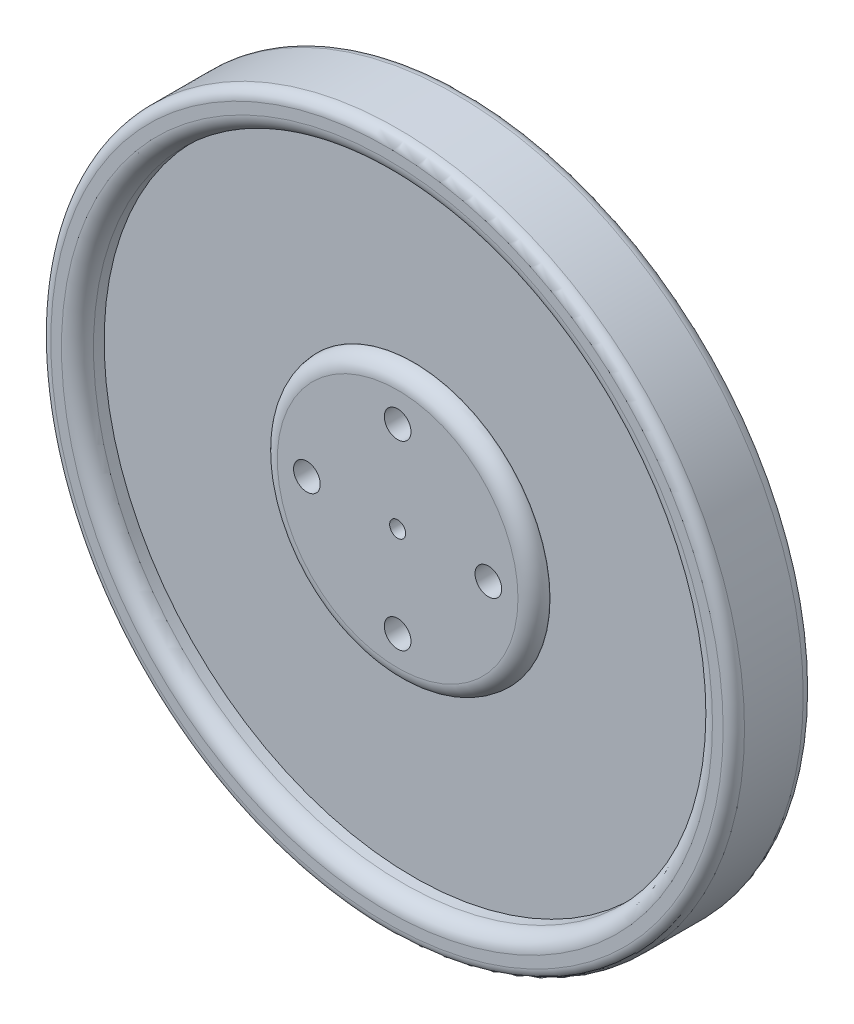
ISO-10303-21;
HEADER;
FILE_DESCRIPTION(('STEP AP214'),'2;1');
FILE_NAME('part.step','',(''),(''),'','','');
FILE_SCHEMA(('AUTOMOTIVE_DESIGN { 1 0 10303 214 1 1 1 1 }'));
ENDSEC;
DATA;
#1=APPLICATION_CONTEXT('core data for automotive mechanical design processes');
#2=APPLICATION_PROTOCOL_DEFINITION('international standard','automotive_design',2000,#1);
#3=PRODUCT_CONTEXT('',#1,'mechanical');
#4=PRODUCT('Part','Part','',(#3));
#5=PRODUCT_RELATED_PRODUCT_CATEGORY('part','',(#4));
#6=PRODUCT_DEFINITION_FORMATION('','',#4);
#7=PRODUCT_DEFINITION_CONTEXT('part definition',#1,'design');
#8=PRODUCT_DEFINITION('design','',#6,#7);
#9=PRODUCT_DEFINITION_SHAPE('','',#8);
#10=(LENGTH_UNIT() NAMED_UNIT(*) SI_UNIT(.MILLI.,.METRE.));
#11=(NAMED_UNIT(*) PLANE_ANGLE_UNIT() SI_UNIT($,.RADIAN.));
#12=(NAMED_UNIT(*) SI_UNIT($,.STERADIAN.) SOLID_ANGLE_UNIT());
#13=UNCERTAINTY_MEASURE_WITH_UNIT(LENGTH_MEASURE(1.E-05),#10,'distance_accuracy_value','');
#14=(GEOMETRIC_REPRESENTATION_CONTEXT(3) GLOBAL_UNCERTAINTY_ASSIGNED_CONTEXT((#13)) GLOBAL_UNIT_ASSIGNED_CONTEXT((#10,
#11,#12)) REPRESENTATION_CONTEXT('',''));
#15=CARTESIAN_POINT('',(0.,0.,0.));
#16=DIRECTION('',(0.,0.,1.));
#17=DIRECTION('',(1.,0.,0.));
#18=AXIS2_PLACEMENT_3D('',#15,#16,#17);
#19=CARTESIAN_POINT('',(0.,-8.5,10.));
#20=DIRECTION('',(0.,0.,-1.));
#21=DIRECTION('',(-1.,0.,0.));
#22=AXIS2_PLACEMENT_3D('',#19,#20,#21);
#23=CYLINDRICAL_SURFACE('',#22,1.25);
#24=CARTESIAN_POINT('',(0.,-8.5,3.));
#25=DIRECTION('',(0.,0.,-1.));
#26=DIRECTION('',(-1.,0.,0.));
#27=AXIS2_PLACEMENT_3D('',#24,#25,#26);
#28=CIRCLE('',#27,1.25);
#29=CARTESIAN_POINT('',(-1.25,-8.5,3.));
#30=VERTEX_POINT('',#29);
#31=EDGE_CURVE('E173',#30,#30,#28,.F.);
#32=ORIENTED_EDGE('',*,*,#31,.F.);
#33=EDGE_LOOP('',(#32));
#34=FACE_BOUND('',#33,.T.);
#35=CARTESIAN_POINT('',(0.,-8.5,6.5));
#36=DIRECTION('',(0.,0.,-1.));
#37=DIRECTION('',(-1.,0.,0.));
#38=AXIS2_PLACEMENT_3D('',#35,#36,#37);
#39=CIRCLE('',#38,1.25);
#40=CARTESIAN_POINT('',(-1.25,-8.5,6.5));
#41=VERTEX_POINT('',#40);
#42=EDGE_CURVE('E185',#41,#41,#39,.T.);
#43=ORIENTED_EDGE('',*,*,#42,.F.);
#44=EDGE_LOOP('',(#43));
#45=FACE_BOUND('',#44,.T.);
#46=ADVANCED_FACE('F128',(#34,#45),#23,.F.);
#47=CARTESIAN_POINT('',(-8.5,0.,10.));
#48=DIRECTION('',(0.,0.,-1.));
#49=DIRECTION('',(-1.,0.,0.));
#50=AXIS2_PLACEMENT_3D('',#47,#48,#49);
#51=CYLINDRICAL_SURFACE('',#50,1.25);
#52=CARTESIAN_POINT('',(-8.5,0.,3.));
#53=DIRECTION('',(0.,0.,-1.));
#54=DIRECTION('',(-1.,0.,0.));
#55=AXIS2_PLACEMENT_3D('',#52,#53,#54);
#56=CIRCLE('',#55,1.25);
#57=CARTESIAN_POINT('',(-9.75,0.,3.));
#58=VERTEX_POINT('',#57);
#59=EDGE_CURVE('E176',#58,#58,#56,.F.);
#60=ORIENTED_EDGE('',*,*,#59,.F.);
#61=EDGE_LOOP('',(#60));
#62=FACE_BOUND('',#61,.T.);
#63=CARTESIAN_POINT('',(-8.5,0.,6.5));
#64=DIRECTION('',(0.,0.,-1.));
#65=DIRECTION('',(-1.,0.,0.));
#66=AXIS2_PLACEMENT_3D('',#63,#64,#65);
#67=CIRCLE('',#66,1.25);
#68=CARTESIAN_POINT('',(-9.75,0.,6.5));
#69=VERTEX_POINT('',#68);
#70=EDGE_CURVE('E188',#69,#69,#67,.T.);
#71=ORIENTED_EDGE('',*,*,#70,.F.);
#72=EDGE_LOOP('',(#71));
#73=FACE_BOUND('',#72,.T.);
#74=ADVANCED_FACE('F229',(#62,#73),#51,.F.);
#75=CARTESIAN_POINT('',(8.5,0.,10.));
#76=DIRECTION('',(0.,0.,-1.));
#77=DIRECTION('',(-1.,0.,0.));
#78=AXIS2_PLACEMENT_3D('',#75,#76,#77);
#79=CYLINDRICAL_SURFACE('',#78,1.25);
#80=CARTESIAN_POINT('',(8.5,0.,3.));
#81=DIRECTION('',(0.,0.,-1.));
#82=DIRECTION('',(-1.,0.,0.));
#83=AXIS2_PLACEMENT_3D('',#80,#81,#82);
#84=CIRCLE('',#83,1.25);
#85=CARTESIAN_POINT('',(7.25,0.,3.));
#86=VERTEX_POINT('',#85);
#87=EDGE_CURVE('E151',#86,#86,#84,.F.);
#88=ORIENTED_EDGE('',*,*,#87,.F.);
#89=EDGE_LOOP('',(#88));
#90=FACE_BOUND('',#89,.T.);
#91=CARTESIAN_POINT('',(8.5,0.,6.5));
#92=DIRECTION('',(0.,0.,-1.));
#93=DIRECTION('',(-1.,0.,0.));
#94=AXIS2_PLACEMENT_3D('',#91,#92,#93);
#95=CIRCLE('',#94,1.25);
#96=CARTESIAN_POINT('',(7.25,0.,6.5));
#97=VERTEX_POINT('',#96);
#98=EDGE_CURVE('E191',#97,#97,#95,.T.);
#99=ORIENTED_EDGE('',*,*,#98,.F.);
#100=EDGE_LOOP('',(#99));
#101=FACE_BOUND('',#100,.T.);
#102=ADVANCED_FACE('F236',(#90,#101),#79,.F.);
#103=CARTESIAN_POINT('',(0.,8.5,10.));
#104=DIRECTION('',(0.,0.,-1.));
#105=DIRECTION('',(-1.,0.,0.));
#106=AXIS2_PLACEMENT_3D('',#103,#104,#105);
#107=CYLINDRICAL_SURFACE('',#106,1.25);
#108=CARTESIAN_POINT('',(0.,8.5,3.));
#109=DIRECTION('',(0.,0.,-1.));
#110=DIRECTION('',(-1.,0.,0.));
#111=AXIS2_PLACEMENT_3D('',#108,#109,#110);
#112=CIRCLE('',#111,1.25);
#113=CARTESIAN_POINT('',(-1.25,8.5,3.));
#114=VERTEX_POINT('',#113);
#115=EDGE_CURVE('E148',#114,#114,#112,.F.);
#116=ORIENTED_EDGE('',*,*,#115,.F.);
#117=EDGE_LOOP('',(#116));
#118=FACE_BOUND('',#117,.T.);
#119=CARTESIAN_POINT('',(0.,8.5,6.5));
#120=DIRECTION('',(0.,0.,-1.));
#121=DIRECTION('',(-1.,0.,0.));
#122=AXIS2_PLACEMENT_3D('',#119,#120,#121);
#123=CIRCLE('',#122,1.25);
#124=CARTESIAN_POINT('',(-1.25,8.5,6.5));
#125=VERTEX_POINT('',#124);
#126=EDGE_CURVE('E147',#125,#125,#123,.T.);
#127=ORIENTED_EDGE('',*,*,#126,.F.);
#128=EDGE_LOOP('',(#127));
#129=FACE_BOUND('',#128,.T.);
#130=ADVANCED_FACE('F263',(#118,#129),#107,.F.);
#131=CARTESIAN_POINT('',(0.,0.,12.));
#132=DIRECTION('',(0.,0.,-1.));
#133=DIRECTION('',(-1.,0.,0.));
#134=AXIS2_PLACEMENT_3D('',#131,#132,#133);
#135=CYLINDRICAL_SURFACE('',#134,32.5);
#136=CARTESIAN_POINT('',(0.,0.,1.));
#137=DIRECTION('',(0.,0.,1.));
#138=DIRECTION('',(1.,0.,0.));
#139=AXIS2_PLACEMENT_3D('',#136,#137,#138);
#140=CIRCLE('',#139,32.5);
#141=CARTESIAN_POINT('',(32.5,0.,1.));
#142=VERTEX_POINT('',#141);
#143=EDGE_CURVE('E155',#142,#142,#140,.T.);
#144=ORIENTED_EDGE('',*,*,#143,.T.);
#145=EDGE_LOOP('',(#144));
#146=FACE_BOUND('',#145,.T.);
#147=CARTESIAN_POINT('',(0.,0.,6.5));
#148=DIRECTION('',(0.,0.,1.));
#149=DIRECTION('',(1.,0.,0.));
#150=AXIS2_PLACEMENT_3D('',#147,#148,#149);
#151=CIRCLE('',#150,32.5);
#152=CARTESIAN_POINT('',(32.5,0.,6.5));
#153=VERTEX_POINT('',#152);
#154=EDGE_CURVE('E158',#153,#153,#151,.F.);
#155=ORIENTED_EDGE('',*,*,#154,.T.);
#156=EDGE_LOOP('',(#155));
#157=FACE_BOUND('',#156,.T.);
#158=ADVANCED_FACE('F256',(#146,#157),#135,.T.);
#159=CARTESIAN_POINT('',(0.,0.,6.));
#160=DIRECTION('',(0.,0.,1.));
#161=DIRECTION('',(1.,0.,0.));
#162=AXIS2_PLACEMENT_3D('',#159,#160,#161);
#163=CYLINDRICAL_SURFACE('',#162,29.);
#164=CARTESIAN_POINT('',(0.,0.,6.));
#165=DIRECTION('',(0.,0.,1.));
#166=DIRECTION('',(1.,0.,0.));
#167=AXIS2_PLACEMENT_3D('',#164,#165,#166);
#168=CIRCLE('',#167,29.);
#169=CARTESIAN_POINT('',(29.,0.,6.));
#170=VERTEX_POINT('',#169);
#171=EDGE_CURVE('E164',#170,#170,#168,.T.);
#172=ORIENTED_EDGE('',*,*,#171,.T.);
#173=EDGE_LOOP('',(#172));
#174=FACE_BOUND('',#173,.T.);
#175=CARTESIAN_POINT('',(0.,0.,5.));
#176=DIRECTION('',(0.,0.,1.));
#177=DIRECTION('',(1.,0.,0.));
#178=AXIS2_PLACEMENT_3D('',#175,#176,#177);
#179=CIRCLE('',#178,29.);
#180=CARTESIAN_POINT('',(29.,0.,5.));
#181=VERTEX_POINT('',#180);
#182=EDGE_CURVE('E170',#181,#181,#179,.T.);
#183=ORIENTED_EDGE('',*,*,#182,.F.);
#184=EDGE_LOOP('',(#183));
#185=FACE_BOUND('',#184,.T.);
#186=ADVANCED_FACE('F253',(#174,#185),#163,.F.);
#187=CARTESIAN_POINT('',(0.,0.,0.));
#188=DIRECTION('',(0.,0.,1.));
#189=DIRECTION('',(1.,0.,0.));
#190=AXIS2_PLACEMENT_3D('',#187,#188,#189);
#191=PLANE('',#190);
#192=CARTESIAN_POINT('',(0.,0.,0.));
#193=DIRECTION('',(0.,0.,-1.));
#194=DIRECTION('',(-1.,0.,0.));
#195=AXIS2_PLACEMENT_3D('',#192,#193,#194);
#196=CIRCLE('',#195,12.25);
#197=CARTESIAN_POINT('',(-12.25,0.,0.));
#198=VERTEX_POINT('',#197);
#199=EDGE_CURVE('E146',#198,#198,#196,.T.);
#200=ORIENTED_EDGE('',*,*,#199,.F.);
#201=EDGE_LOOP('',(#200));
#202=FACE_BOUND('',#201,.T.);
#203=CARTESIAN_POINT('',(0.,0.,0.));
#204=DIRECTION('',(0.,0.,1.));
#205=DIRECTION('',(1.,0.,0.));
#206=AXIS2_PLACEMENT_3D('',#203,#204,#205);
#207=CIRCLE('',#206,31.5);
#208=CARTESIAN_POINT('',(31.5,0.,0.));
#209=VERTEX_POINT('',#208);
#210=EDGE_CURVE('E140',#209,#209,#207,.F.);
#211=ORIENTED_EDGE('',*,*,#210,.T.);
#212=EDGE_LOOP('',(#211));
#213=FACE_BOUND('',#212,.T.);
#214=ADVANCED_FACE('F251',(#202,#213),#191,.F.);
#215=CARTESIAN_POINT('',(0.,0.,5.));
#216=DIRECTION('',(0.,0.,1.));
#217=DIRECTION('',(1.,0.,0.));
#218=AXIS2_PLACEMENT_3D('',#215,#216,#217);
#219=PLANE('',#218);
#220=CARTESIAN_POINT('',(0.,0.,5.));
#221=DIRECTION('',(0.,0.,1.));
#222=DIRECTION('',(1.,0.,0.));
#223=AXIS2_PLACEMENT_3D('',#220,#221,#222);
#224=CIRCLE('',#223,12.7761825973923);
#225=CARTESIAN_POINT('',(12.7761825973923,0.,5.));
#226=VERTEX_POINT('',#225);
#227=EDGE_CURVE('E143',#226,#226,#224,.T.);
#228=ORIENTED_EDGE('',*,*,#227,.F.);
#229=EDGE_LOOP('',(#228));
#230=FACE_BOUND('',#229,.T.);
#231=ORIENTED_EDGE('',*,*,#182,.T.);
#232=EDGE_LOOP('',(#231));
#233=FACE_BOUND('',#232,.T.);
#234=ADVANCED_FACE('F247',(#230,#233),#219,.T.);
#235=CARTESIAN_POINT('',(0.,0.,7.5));
#236=DIRECTION('',(0.,0.,1.));
#237=DIRECTION('',(1.,0.,0.));
#238=AXIS2_PLACEMENT_3D('',#235,#236,#237);
#239=PLANE('',#238);
#240=CARTESIAN_POINT('',(0.,0.,7.5));
#241=DIRECTION('',(0.,0.,1.));
#242=DIRECTION('',(1.,0.,0.));
#243=AXIS2_PLACEMENT_3D('',#240,#241,#242);
#244=CIRCLE('',#243,31.5);
#245=CARTESIAN_POINT('',(31.5,0.,7.5));
#246=VERTEX_POINT('',#245);
#247=EDGE_CURVE('E161',#246,#246,#244,.T.);
#248=ORIENTED_EDGE('',*,*,#247,.T.);
#249=EDGE_LOOP('',(#248));
#250=FACE_BOUND('',#249,.T.);
#251=CARTESIAN_POINT('',(0.,0.,7.5));
#252=DIRECTION('',(0.,0.,1.));
#253=DIRECTION('',(1.,0.,0.));
#254=AXIS2_PLACEMENT_3D('',#251,#252,#253);
#255=CIRCLE('',#254,30.5);
#256=CARTESIAN_POINT('',(30.5,0.,7.5));
#257=VERTEX_POINT('',#256);
#258=EDGE_CURVE('E167',#257,#257,#255,.F.);
#259=ORIENTED_EDGE('',*,*,#258,.T.);
#260=EDGE_LOOP('',(#259));
#261=FACE_BOUND('',#260,.T.);
#262=ADVANCED_FACE('F243',(#250,#261),#239,.T.);
#263=CARTESIAN_POINT('',(0.,0.,6.));
#264=DIRECTION('',(0.,0.,1.));
#265=DIRECTION('',(1.,0.,0.));
#266=AXIS2_PLACEMENT_3D('',#263,#264,#265);
#267=TOROIDAL_SURFACE('',#266,30.5,1.5);
#268=ORIENTED_EDGE('',*,*,#171,.F.);
#269=EDGE_LOOP('',(#268));
#270=FACE_BOUND('',#269,.T.);
#271=ORIENTED_EDGE('',*,*,#258,.F.);
#272=EDGE_LOOP('',(#271));
#273=FACE_BOUND('',#272,.T.);
#274=ADVANCED_FACE('F246',(#270,#273),#267,.T.);
#275=CARTESIAN_POINT('',(0.,0.,6.5));
#276=DIRECTION('',(0.,0.,1.));
#277=DIRECTION('',(1.,0.,0.));
#278=AXIS2_PLACEMENT_3D('',#275,#276,#277);
#279=TOROIDAL_SURFACE('',#278,31.5,1.);
#280=ORIENTED_EDGE('',*,*,#154,.F.);
#281=EDGE_LOOP('',(#280));
#282=FACE_BOUND('',#281,.T.);
#283=ORIENTED_EDGE('',*,*,#247,.F.);
#284=EDGE_LOOP('',(#283));
#285=FACE_BOUND('',#284,.T.);
#286=ADVANCED_FACE('F267',(#282,#285),#279,.T.);
#287=CARTESIAN_POINT('',(0.,0.,1.));
#288=DIRECTION('',(0.,0.,1.));
#289=DIRECTION('',(1.,0.,0.));
#290=AXIS2_PLACEMENT_3D('',#287,#288,#289);
#291=TOROIDAL_SURFACE('',#290,31.5,1.);
#292=ORIENTED_EDGE('',*,*,#210,.F.);
#293=EDGE_LOOP('',(#292));
#294=FACE_BOUND('',#293,.T.);
#295=ORIENTED_EDGE('',*,*,#143,.F.);
#296=EDGE_LOOP('',(#295));
#297=FACE_BOUND('',#296,.T.);
#298=ADVANCED_FACE('F271',(#294,#297),#291,.T.);
#299=CARTESIAN_POINT('',(0.,0.,3.));
#300=DIRECTION('',(0.,0.,-1.));
#301=DIRECTION('',(-1.,0.,0.));
#302=AXIS2_PLACEMENT_3D('',#299,#300,#301);
#303=PLANE('',#302);
#304=CARTESIAN_POINT('',(0.,0.,3.));
#305=DIRECTION('',(0.,0.,-1.));
#306=DIRECTION('',(-1.,0.,0.));
#307=AXIS2_PLACEMENT_3D('',#304,#305,#306);
#308=CIRCLE('',#307,0.75);
#309=CARTESIAN_POINT('',(-0.75,0.,3.));
#310=VERTEX_POINT('',#309);
#311=EDGE_CURVE('E196',#310,#310,#308,.T.);
#312=ORIENTED_EDGE('',*,*,#311,.F.);
#313=EDGE_LOOP('',(#312));
#314=FACE_BOUND('',#313,.T.);
#315=CARTESIAN_POINT('',(0.,0.,3.));
#316=DIRECTION('',(0.,0.,-1.));
#317=DIRECTION('',(-1.,0.,0.));
#318=AXIS2_PLACEMENT_3D('',#315,#316,#317);
#319=CIRCLE('',#318,12.25);
#320=CARTESIAN_POINT('',(-12.25,0.,3.));
#321=VERTEX_POINT('',#320);
#322=EDGE_CURVE('E152',#321,#321,#319,.T.);
#323=ORIENTED_EDGE('',*,*,#322,.T.);
#324=EDGE_LOOP('',(#323));
#325=FACE_BOUND('',#324,.T.);
#326=ORIENTED_EDGE('',*,*,#115,.T.);
#327=EDGE_LOOP('',(#326));
#328=FACE_BOUND('',#327,.T.);
#329=ORIENTED_EDGE('',*,*,#87,.T.);
#330=EDGE_LOOP('',(#329));
#331=FACE_BOUND('',#330,.T.);
#332=ORIENTED_EDGE('',*,*,#59,.T.);
#333=EDGE_LOOP('',(#332));
#334=FACE_BOUND('',#333,.T.);
#335=ORIENTED_EDGE('',*,*,#31,.T.);
#336=EDGE_LOOP('',(#335));
#337=FACE_BOUND('',#336,.T.);
#338=ADVANCED_FACE('F273',(#314,#325,#328,#331,#334,#337),#303,.T.);
#339=CARTESIAN_POINT('',(0.,0.,3.));
#340=DIRECTION('',(0.,0.,-1.));
#341=DIRECTION('',(-1.,0.,0.));
#342=AXIS2_PLACEMENT_3D('',#339,#340,#341);
#343=CYLINDRICAL_SURFACE('',#342,12.25);
#344=ORIENTED_EDGE('',*,*,#322,.F.);
#345=EDGE_LOOP('',(#344));
#346=FACE_BOUND('',#345,.T.);
#347=ORIENTED_EDGE('',*,*,#199,.T.);
#348=EDGE_LOOP('',(#347));
#349=FACE_BOUND('',#348,.T.);
#350=ADVANCED_FACE('F209',(#346,#349),#343,.F.);
#351=CARTESIAN_POINT('',(0.,0.,6.5));
#352=DIRECTION('',(0.,0.,1.));
#353=DIRECTION('',(1.,0.,0.));
#354=AXIS2_PLACEMENT_3D('',#351,#352,#353);
#355=PLANE('',#354);
#356=CARTESIAN_POINT('',(0.,0.,6.5));
#357=DIRECTION('',(0.,0.,1.));
#358=DIRECTION('',(1.,0.,0.));
#359=AXIS2_PLACEMENT_3D('',#356,#357,#358);
#360=CIRCLE('',#359,0.75);
#361=CARTESIAN_POINT('',(0.75,0.,6.5));
#362=VERTEX_POINT('',#361);
#363=EDGE_CURVE('E132',#362,#362,#360,.T.);
#364=ORIENTED_EDGE('',*,*,#363,.F.);
#365=EDGE_LOOP('',(#364));
#366=FACE_BOUND('',#365,.T.);
#367=ORIENTED_EDGE('',*,*,#126,.T.);
#368=EDGE_LOOP('',(#367));
#369=FACE_BOUND('',#368,.T.);
#370=ORIENTED_EDGE('',*,*,#98,.T.);
#371=EDGE_LOOP('',(#370));
#372=FACE_BOUND('',#371,.T.);
#373=ORIENTED_EDGE('',*,*,#70,.T.);
#374=EDGE_LOOP('',(#373));
#375=FACE_BOUND('',#374,.T.);
#376=ORIENTED_EDGE('',*,*,#42,.T.);
#377=EDGE_LOOP('',(#376));
#378=FACE_BOUND('',#377,.T.);
#379=CARTESIAN_POINT('',(0.,0.,6.5));
#380=DIRECTION('',(0.,0.,1.));
#381=DIRECTION('',(1.,0.,0.));
#382=AXIS2_PLACEMENT_3D('',#379,#380,#381);
#383=CIRCLE('',#382,11.2759541053265);
#384=CARTESIAN_POINT('',(11.2759541053265,0.,6.5));
#385=VERTEX_POINT('',#384);
#386=EDGE_CURVE('E136',#385,#385,#383,.T.);
#387=ORIENTED_EDGE('',*,*,#386,.T.);
#388=EDGE_LOOP('',(#387));
#389=FACE_BOUND('',#388,.T.);
#390=ADVANCED_FACE('F205',(#366,#369,#372,#375,#378,#389),#355,.T.);
#391=CARTESIAN_POINT('',(0.,0.,6.5));
#392=DIRECTION('',(0.,0.,-1.));
#393=DIRECTION('',(1.,0.,0.));
#394=AXIS2_PLACEMENT_3D('',#391,#392,#393);
#395=CONICAL_SURFACE('',#394,12.75,0.0174532925199433);
#396=CARTESIAN_POINT('',(0.,0.,5.02617860965593));
#397=DIRECTION('',(0.,0.,-1.));
#398=DIRECTION('',(-1.,0.,0.));
#399=AXIS2_PLACEMENT_3D('',#396,#397,#398);
#400=CIRCLE('',#399,12.7757256480611);
#401=CARTESIAN_POINT('',(-12.7757256480611,0.,5.02617860965593));
#402=VERTEX_POINT('',#401);
#403=EDGE_CURVE('E11',#402,#402,#400,.T.);
#404=ORIENTED_EDGE('',*,*,#403,.T.);
#405=EDGE_LOOP('',(#404));
#406=FACE_BOUND('',#405,.T.);
#407=ORIENTED_EDGE('',*,*,#227,.T.);
#408=EDGE_LOOP('',(#407));
#409=FACE_BOUND('',#408,.T.);
#410=ADVANCED_FACE('F208',(#406,#409),#395,.T.);
#411=CARTESIAN_POINT('',(0.,0.,5.));
#412=DIRECTION('',(0.,0.,1.));
#413=DIRECTION('',(1.,0.,0.));
#414=AXIS2_PLACEMENT_3D('',#411,#412,#413);
#415=TOROIDAL_SURFACE('',#414,11.2759541053265,1.5);
#416=ORIENTED_EDGE('',*,*,#403,.F.);
#417=EDGE_LOOP('',(#416));
#418=FACE_BOUND('',#417,.T.);
#419=ORIENTED_EDGE('',*,*,#386,.F.);
#420=EDGE_LOOP('',(#419));
#421=FACE_BOUND('',#420,.T.);
#422=ADVANCED_FACE('F130',(#418,#421),#415,.T.);
#423=CARTESIAN_POINT('',(0.,0.,15.5));
#424=DIRECTION('',(0.,0.,-1.));
#425=DIRECTION('',(-1.,0.,0.));
#426=AXIS2_PLACEMENT_3D('',#423,#424,#425);
#427=CYLINDRICAL_SURFACE('',#426,0.75);
#428=ORIENTED_EDGE('',*,*,#363,.T.);
#429=EDGE_LOOP('',(#428));
#430=FACE_BOUND('',#429,.T.);
#431=ORIENTED_EDGE('',*,*,#311,.T.);
#432=EDGE_LOOP('',(#431));
#433=FACE_BOUND('',#432,.T.);
#434=ADVANCED_FACE('F203',(#430,#433),#427,.F.);
#435=CLOSED_SHELL('',(#46,#74,#102,#130,#158,#186,#214,#234,#262,#274,#286,#298,#338,#350,#390,
#410,#422,#434));
#436=MANIFOLD_SOLID_BREP('B2',#435);
#437=ADVANCED_BREP_SHAPE_REPRESENTATION('',(#18,#436),#14);
#438=SHAPE_DEFINITION_REPRESENTATION(#9,#437);
ENDSEC;
END-ISO-10303-21;
